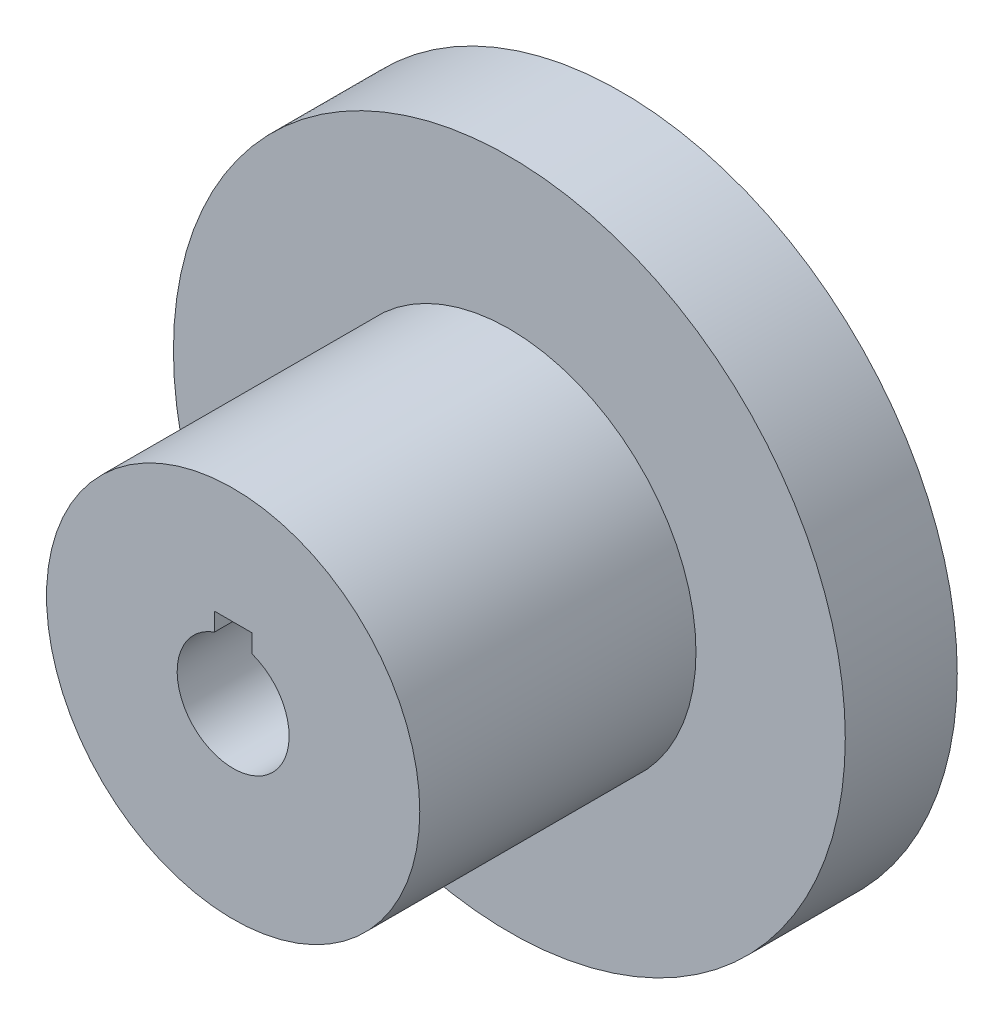
ISO-10303-21;
HEADER;
FILE_DESCRIPTION(('STEP AP214'),'2;1');
FILE_NAME('part.step','',(''),(''),'','','');
FILE_SCHEMA(('AUTOMOTIVE_DESIGN { 1 0 10303 214 1 1 1 1 }'));
ENDSEC;
DATA;
#1=APPLICATION_CONTEXT('core data for automotive mechanical design processes');
#2=APPLICATION_PROTOCOL_DEFINITION('international standard','automotive_design',2000,#1);
#3=PRODUCT_CONTEXT('',#1,'mechanical');
#4=PRODUCT('Part','Part','',(#3));
#5=PRODUCT_RELATED_PRODUCT_CATEGORY('part','',(#4));
#6=PRODUCT_DEFINITION_FORMATION('','',#4);
#7=PRODUCT_DEFINITION_CONTEXT('part definition',#1,'design');
#8=PRODUCT_DEFINITION('design','',#6,#7);
#9=PRODUCT_DEFINITION_SHAPE('','',#8);
#10=(LENGTH_UNIT() NAMED_UNIT(*) SI_UNIT(.MILLI.,.METRE.));
#11=(NAMED_UNIT(*) PLANE_ANGLE_UNIT() SI_UNIT($,.RADIAN.));
#12=(NAMED_UNIT(*) SI_UNIT($,.STERADIAN.) SOLID_ANGLE_UNIT());
#13=UNCERTAINTY_MEASURE_WITH_UNIT(LENGTH_MEASURE(1.E-05),#10,'distance_accuracy_value','');
#14=(GEOMETRIC_REPRESENTATION_CONTEXT(3) GLOBAL_UNCERTAINTY_ASSIGNED_CONTEXT((#13)) GLOBAL_UNIT_ASSIGNED_CONTEXT((#10,
#11,#12)) REPRESENTATION_CONTEXT('',''));
#15=CARTESIAN_POINT('',(0.,0.,0.));
#16=DIRECTION('',(0.,0.,1.));
#17=DIRECTION('',(1.,0.,0.));
#18=AXIS2_PLACEMENT_3D('',#15,#16,#17);
#19=CARTESIAN_POINT('',(0.,0.,-46.99));
#20=DIRECTION('',(0.,0.,1.));
#21=DIRECTION('',(1.,0.,0.));
#22=AXIS2_PLACEMENT_3D('',#19,#20,#21);
#23=CYLINDRICAL_SURFACE('',#22,31.75);
#24=CARTESIAN_POINT('',(0.,0.,-46.99));
#25=DIRECTION('',(0.,0.,-1.));
#26=DIRECTION('',(-1.,0.,0.));
#27=AXIS2_PLACEMENT_3D('',#24,#25,#26);
#28=CIRCLE('',#27,31.75);
#29=CARTESIAN_POINT('',(-31.75,0.,-46.99));
#30=VERTEX_POINT('',#29);
#31=EDGE_CURVE('E126',#30,#30,#28,.F.);
#32=ORIENTED_EDGE('',*,*,#31,.T.);
#33=EDGE_LOOP('',(#32));
#34=FACE_BOUND('',#33,.T.);
#35=CARTESIAN_POINT('',(0.,0.,0.));
#36=DIRECTION('',(0.,0.,1.));
#37=DIRECTION('',(1.,0.,0.));
#38=AXIS2_PLACEMENT_3D('',#35,#36,#37);
#39=CIRCLE('',#38,31.75);
#40=CARTESIAN_POINT('',(31.75,0.,0.));
#41=VERTEX_POINT('',#40);
#42=EDGE_CURVE('E129',#41,#41,#39,.T.);
#43=ORIENTED_EDGE('',*,*,#42,.F.);
#44=EDGE_LOOP('',(#43));
#45=FACE_BOUND('',#44,.T.);
#46=ADVANCED_FACE('F47',(#34,#45),#23,.T.);
#47=CARTESIAN_POINT('',(0.,0.,0.));
#48=DIRECTION('',(0.,0.,1.));
#49=DIRECTION('',(1.,0.,0.));
#50=AXIS2_PLACEMENT_3D('',#47,#48,#49);
#51=PLANE('',#50);
#52=DIRECTION('',(0.,-1.,0.));
#53=VECTOR('',#52,1.);
#54=CARTESIAN_POINT('',(-3.175,12.065,0.));
#55=LINE('',#54,#53);
#56=CARTESIAN_POINT('',(-3.175,12.065,0.));
#57=VERTEX_POINT('',#56);
#58=CARTESIAN_POINT('',(-3.175,8.98025612106916,0.));
#59=VERTEX_POINT('',#58);
#60=EDGE_CURVE('E61',#57,#59,#55,.T.);
#61=ORIENTED_EDGE('',*,*,#60,.F.);
#62=DIRECTION('',(-1.,0.,0.));
#63=VECTOR('',#62,1.);
#64=CARTESIAN_POINT('',(-3.175,12.065,0.));
#65=LINE('',#64,#63);
#66=CARTESIAN_POINT('',(3.175,12.065,0.));
#67=VERTEX_POINT('',#66);
#68=EDGE_CURVE('E105',#67,#57,#65,.T.);
#69=ORIENTED_EDGE('',*,*,#68,.F.);
#70=DIRECTION('',(0.,1.,0.));
#71=VECTOR('',#70,1.);
#72=CARTESIAN_POINT('',(3.175,12.065,0.));
#73=LINE('',#72,#71);
#74=CARTESIAN_POINT('',(3.175,8.98025612106916,0.));
#75=VERTEX_POINT('',#74);
#76=EDGE_CURVE('E89',#75,#67,#73,.T.);
#77=ORIENTED_EDGE('',*,*,#76,.F.);
#78=CARTESIAN_POINT('',(0.,0.,0.));
#79=DIRECTION('',(0.,0.,1.));
#80=DIRECTION('',(1.,0.,0.));
#81=AXIS2_PLACEMENT_3D('',#78,#79,#80);
#82=CIRCLE('',#81,9.525);
#83=EDGE_CURVE('E98',#59,#75,#82,.T.);
#84=ORIENTED_EDGE('',*,*,#83,.F.);
#85=EDGE_LOOP('',(#61,#69,#77,#84));
#86=FACE_BOUND('',#85,.T.);
#87=ORIENTED_EDGE('',*,*,#42,.T.);
#88=EDGE_LOOP('',(#87));
#89=FACE_BOUND('',#88,.T.);
#90=ADVANCED_FACE('F102',(#86,#89),#51,.T.);
#91=CARTESIAN_POINT('',(0.,0.,-66.04));
#92=DIRECTION('',(0.,0.,1.));
#93=DIRECTION('',(1.,0.,0.));
#94=AXIS2_PLACEMENT_3D('',#91,#92,#93);
#95=CYLINDRICAL_SURFACE('',#94,57.15);
#96=CARTESIAN_POINT('',(0.,0.,-66.04));
#97=DIRECTION('',(0.,0.,-1.));
#98=DIRECTION('',(-1.,0.,0.));
#99=AXIS2_PLACEMENT_3D('',#96,#97,#98);
#100=CIRCLE('',#99,57.15);
#101=CARTESIAN_POINT('',(-57.15,0.,-66.04));
#102=VERTEX_POINT('',#101);
#103=EDGE_CURVE('E123',#102,#102,#100,.T.);
#104=ORIENTED_EDGE('',*,*,#103,.F.);
#105=EDGE_LOOP('',(#104));
#106=FACE_BOUND('',#105,.T.);
#107=CARTESIAN_POINT('',(0.,0.,-46.99));
#108=DIRECTION('',(0.,0.,-1.));
#109=DIRECTION('',(-1.,0.,0.));
#110=AXIS2_PLACEMENT_3D('',#107,#108,#109);
#111=CIRCLE('',#110,57.15);
#112=CARTESIAN_POINT('',(-57.15,0.,-46.99));
#113=VERTEX_POINT('',#112);
#114=EDGE_CURVE('E120',#113,#113,#111,.T.);
#115=ORIENTED_EDGE('',*,*,#114,.T.);
#116=EDGE_LOOP('',(#115));
#117=FACE_BOUND('',#116,.T.);
#118=ADVANCED_FACE('F158',(#106,#117),#95,.T.);
#119=CARTESIAN_POINT('',(0.,0.,-66.04));
#120=DIRECTION('',(0.,0.,-1.));
#121=DIRECTION('',(-1.,0.,0.));
#122=AXIS2_PLACEMENT_3D('',#119,#120,#121);
#123=PLANE('',#122);
#124=CARTESIAN_POINT('',(0.,0.,-66.04));
#125=DIRECTION('',(0.,0.,-1.));
#126=DIRECTION('',(-1.,0.,0.));
#127=AXIS2_PLACEMENT_3D('',#124,#125,#126);
#128=CIRCLE('',#127,47.625);
#129=CARTESIAN_POINT('',(-47.625,0.,-66.04));
#130=VERTEX_POINT('',#129);
#131=EDGE_CURVE('E112',#130,#130,#128,.T.);
#132=ORIENTED_EDGE('',*,*,#131,.F.);
#133=EDGE_LOOP('',(#132));
#134=FACE_BOUND('',#133,.T.);
#135=ORIENTED_EDGE('',*,*,#103,.T.);
#136=EDGE_LOOP('',(#135));
#137=FACE_BOUND('',#136,.T.);
#138=ADVANCED_FACE('F166',(#134,#137),#123,.T.);
#139=CARTESIAN_POINT('',(0.,0.,-46.99));
#140=DIRECTION('',(0.,0.,-1.));
#141=DIRECTION('',(-1.,0.,0.));
#142=AXIS2_PLACEMENT_3D('',#139,#140,#141);
#143=PLANE('',#142);
#144=ORIENTED_EDGE('',*,*,#31,.F.);
#145=EDGE_LOOP('',(#144));
#146=FACE_BOUND('',#145,.T.);
#147=ORIENTED_EDGE('',*,*,#114,.F.);
#148=EDGE_LOOP('',(#147));
#149=FACE_BOUND('',#148,.T.);
#150=ADVANCED_FACE('F163',(#146,#149),#143,.F.);
#151=CARTESIAN_POINT('',(0.,0.,87.7138418160373));
#152=DIRECTION('',(0.,0.,-1.));
#153=DIRECTION('',(-1.,0.,0.));
#154=AXIS2_PLACEMENT_3D('',#151,#152,#153);
#155=CYLINDRICAL_SURFACE('',#154,47.625);
#156=CARTESIAN_POINT('',(0.,0.,-53.34));
#157=DIRECTION('',(0.,0.,-1.));
#158=DIRECTION('',(-1.,0.,0.));
#159=AXIS2_PLACEMENT_3D('',#156,#157,#158);
#160=CIRCLE('',#159,47.625);
#161=CARTESIAN_POINT('',(-47.625,0.,-53.34));
#162=VERTEX_POINT('',#161);
#163=EDGE_CURVE('E117',#162,#162,#160,.F.);
#164=ORIENTED_EDGE('',*,*,#163,.T.);
#165=EDGE_LOOP('',(#164));
#166=FACE_BOUND('',#165,.T.);
#167=ORIENTED_EDGE('',*,*,#131,.T.);
#168=EDGE_LOOP('',(#167));
#169=FACE_BOUND('',#168,.T.);
#170=ADVANCED_FACE('F150',(#166,#169),#155,.F.);
#171=CARTESIAN_POINT('',(0.,0.,-53.34));
#172=DIRECTION('',(0.,0.,-1.));
#173=DIRECTION('',(-1.,0.,0.));
#174=AXIS2_PLACEMENT_3D('',#171,#172,#173);
#175=PLANE('',#174);
#176=DIRECTION('',(0.,1.,0.));
#177=VECTOR('',#176,1.);
#178=CARTESIAN_POINT('',(-3.175,0.,-53.34));
#179=LINE('',#178,#177);
#180=CARTESIAN_POINT('',(-3.175,8.98025612106916,-53.34));
#181=VERTEX_POINT('',#180);
#182=CARTESIAN_POINT('',(-3.175,12.065,-53.34));
#183=VERTEX_POINT('',#182);
#184=EDGE_CURVE('E13',#181,#183,#179,.T.);
#185=ORIENTED_EDGE('',*,*,#184,.F.);
#186=CARTESIAN_POINT('',(0.,0.,-53.34));
#187=DIRECTION('',(0.,0.,-1.));
#188=DIRECTION('',(-1.,0.,0.));
#189=AXIS2_PLACEMENT_3D('',#186,#187,#188);
#190=CIRCLE('',#189,9.525);
#191=CARTESIAN_POINT('',(3.175,8.98025612106916,-53.34));
#192=VERTEX_POINT('',#191);
#193=EDGE_CURVE('E132',#192,#181,#190,.T.);
#194=ORIENTED_EDGE('',*,*,#193,.F.);
#195=DIRECTION('',(0.,-1.,0.));
#196=VECTOR('',#195,1.);
#197=CARTESIAN_POINT('',(3.175,0.,-53.34));
#198=LINE('',#197,#196);
#199=CARTESIAN_POINT('',(3.175,12.065,-53.34));
#200=VERTEX_POINT('',#199);
#201=EDGE_CURVE('E92',#200,#192,#198,.T.);
#202=ORIENTED_EDGE('',*,*,#201,.F.);
#203=DIRECTION('',(1.,0.,0.));
#204=VECTOR('',#203,1.);
#205=CARTESIAN_POINT('',(0.,12.065,-53.34));
#206=LINE('',#205,#204);
#207=EDGE_CURVE('E54',#183,#200,#206,.T.);
#208=ORIENTED_EDGE('',*,*,#207,.F.);
#209=EDGE_LOOP('',(#185,#194,#202,#208));
#210=FACE_BOUND('',#209,.T.);
#211=ORIENTED_EDGE('',*,*,#163,.F.);
#212=EDGE_LOOP('',(#211));
#213=FACE_BOUND('',#212,.T.);
#214=ADVANCED_FACE('F140',(#210,#213),#175,.T.);
#215=CARTESIAN_POINT('',(-3.175,12.065,-66.04));
#216=DIRECTION('',(-1.,0.,0.));
#217=DIRECTION('',(0.,0.,1.));
#218=AXIS2_PLACEMENT_3D('',#215,#216,#217);
#219=PLANE('',#218);
#220=ORIENTED_EDGE('',*,*,#184,.T.);
#221=DIRECTION('',(0.,0.,1.));
#222=VECTOR('',#221,1.);
#223=CARTESIAN_POINT('',(-3.175,12.065,-66.04));
#224=LINE('',#223,#222);
#225=EDGE_CURVE('E110',#183,#57,#224,.T.);
#226=ORIENTED_EDGE('',*,*,#225,.T.);
#227=ORIENTED_EDGE('',*,*,#60,.T.);
#228=DIRECTION('',(0.,0.,1.));
#229=VECTOR('',#228,1.);
#230=CARTESIAN_POINT('',(-3.175,8.98025612106916,-66.04));
#231=LINE('',#230,#229);
#232=EDGE_CURVE('E95',#181,#59,#231,.T.);
#233=ORIENTED_EDGE('',*,*,#232,.F.);
#234=EDGE_LOOP('',(#220,#226,#227,#233));
#235=FACE_BOUND('',#234,.T.);
#236=ADVANCED_FACE('F142',(#235),#219,.F.);
#237=CARTESIAN_POINT('',(-3.175,12.065,-66.04));
#238=DIRECTION('',(0.,1.,0.));
#239=DIRECTION('',(0.,0.,1.));
#240=AXIS2_PLACEMENT_3D('',#237,#238,#239);
#241=PLANE('',#240);
#242=ORIENTED_EDGE('',*,*,#207,.T.);
#243=DIRECTION('',(0.,0.,1.));
#244=VECTOR('',#243,1.);
#245=CARTESIAN_POINT('',(3.175,12.065,-66.04));
#246=LINE('',#245,#244);
#247=EDGE_CURVE('E94',#200,#67,#246,.T.);
#248=ORIENTED_EDGE('',*,*,#247,.T.);
#249=ORIENTED_EDGE('',*,*,#68,.T.);
#250=ORIENTED_EDGE('',*,*,#225,.F.);
#251=EDGE_LOOP('',(#242,#248,#249,#250));
#252=FACE_BOUND('',#251,.T.);
#253=ADVANCED_FACE('F137',(#252),#241,.F.);
#254=CARTESIAN_POINT('',(3.175,12.065,-66.04));
#255=DIRECTION('',(1.,0.,0.));
#256=DIRECTION('',(0.,1.,0.));
#257=AXIS2_PLACEMENT_3D('',#254,#255,#256);
#258=PLANE('',#257);
#259=ORIENTED_EDGE('',*,*,#201,.T.);
#260=DIRECTION('',(0.,0.,1.));
#261=VECTOR('',#260,1.);
#262=CARTESIAN_POINT('',(3.175,8.98025612106916,-66.04));
#263=LINE('',#262,#261);
#264=EDGE_CURVE('E69',#192,#75,#263,.T.);
#265=ORIENTED_EDGE('',*,*,#264,.T.);
#266=ORIENTED_EDGE('',*,*,#76,.T.);
#267=ORIENTED_EDGE('',*,*,#247,.F.);
#268=EDGE_LOOP('',(#259,#265,#266,#267));
#269=FACE_BOUND('',#268,.T.);
#270=ADVANCED_FACE('F86',(#269),#258,.F.);
#271=CARTESIAN_POINT('',(0.,0.,-66.04));
#272=DIRECTION('',(0.,0.,1.));
#273=DIRECTION('',(1.,0.,0.));
#274=AXIS2_PLACEMENT_3D('',#271,#272,#273);
#275=CYLINDRICAL_SURFACE('',#274,9.525);
#276=ORIENTED_EDGE('',*,*,#193,.T.);
#277=ORIENTED_EDGE('',*,*,#232,.T.);
#278=ORIENTED_EDGE('',*,*,#83,.T.);
#279=ORIENTED_EDGE('',*,*,#264,.F.);
#280=EDGE_LOOP('',(#276,#277,#278,#279));
#281=FACE_BOUND('',#280,.T.);
#282=ADVANCED_FACE('F99',(#281),#275,.F.);
#283=CLOSED_SHELL('',(#46,#90,#118,#138,#150,#170,#214,#236,#253,#270,#282));
#284=MANIFOLD_SOLID_BREP('B2',#283);
#285=ADVANCED_BREP_SHAPE_REPRESENTATION('',(#18,#284),#14);
#286=SHAPE_DEFINITION_REPRESENTATION(#9,#285);
ENDSEC;
END-ISO-10303-21;
